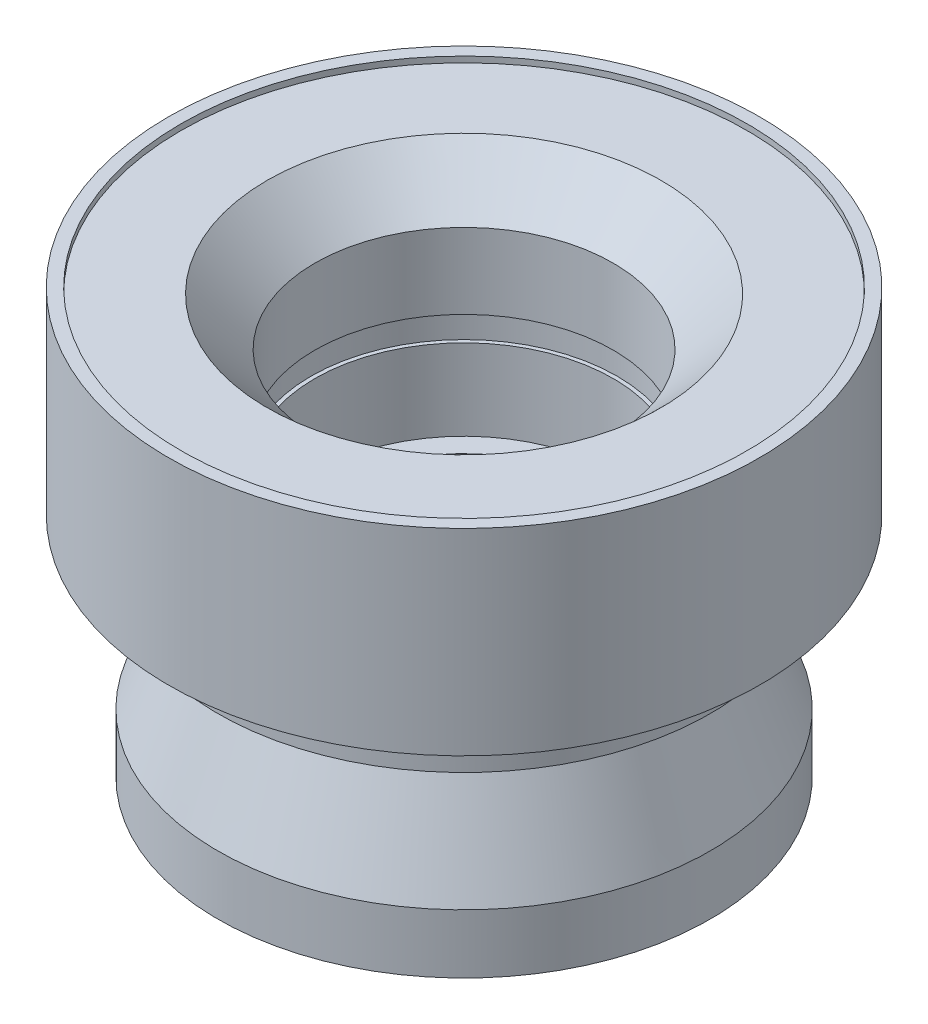
ISO-10303-21;
HEADER;
FILE_DESCRIPTION(('STEP AP214'),'2;1');
FILE_NAME('part.step','',(''),(''),'','','');
FILE_SCHEMA(('AUTOMOTIVE_DESIGN { 1 0 10303 214 1 1 1 1 }'));
ENDSEC;
DATA;
#1=APPLICATION_CONTEXT('core data for automotive mechanical design processes');
#2=APPLICATION_PROTOCOL_DEFINITION('international standard','automotive_design',2000,#1);
#3=PRODUCT_CONTEXT('',#1,'mechanical');
#4=PRODUCT('Part','Part','',(#3));
#5=PRODUCT_RELATED_PRODUCT_CATEGORY('part','',(#4));
#6=PRODUCT_DEFINITION_FORMATION('','',#4);
#7=PRODUCT_DEFINITION_CONTEXT('part definition',#1,'design');
#8=PRODUCT_DEFINITION('design','',#6,#7);
#9=PRODUCT_DEFINITION_SHAPE('','',#8);
#10=(LENGTH_UNIT() NAMED_UNIT(*) SI_UNIT(.MILLI.,.METRE.));
#11=(NAMED_UNIT(*) PLANE_ANGLE_UNIT() SI_UNIT($,.RADIAN.));
#12=(NAMED_UNIT(*) SI_UNIT($,.STERADIAN.) SOLID_ANGLE_UNIT());
#13=UNCERTAINTY_MEASURE_WITH_UNIT(LENGTH_MEASURE(1.E-05),#10,'distance_accuracy_value','');
#14=(GEOMETRIC_REPRESENTATION_CONTEXT(3) GLOBAL_UNCERTAINTY_ASSIGNED_CONTEXT((#13)) GLOBAL_UNIT_ASSIGNED_CONTEXT((#10,
#11,#12)) REPRESENTATION_CONTEXT('',''));
#15=CARTESIAN_POINT('',(0.,0.,0.));
#16=DIRECTION('',(0.,0.,1.));
#17=DIRECTION('',(1.,0.,0.));
#18=AXIS2_PLACEMENT_3D('',#15,#16,#17);
#19=CARTESIAN_POINT('',(36.5125,19.8120000000001,0.));
#20=DIRECTION('',(0.,-1.,0.));
#21=DIRECTION('',(1.,0.,0.));
#22=AXIS2_PLACEMENT_3D('',#19,#20,#21);
#23=PLANE('',#22);
#24=CARTESIAN_POINT('',(0.,19.8120000000001,0.));
#25=DIRECTION('',(0.,1.,0.));
#26=DIRECTION('',(-1.,0.,0.));
#27=AXIS2_PLACEMENT_3D('',#24,#25,#26);
#28=CIRCLE('',#27,36.5125);
#29=CARTESIAN_POINT('',(-36.5125,19.8120000000001,0.));
#30=VERTEX_POINT('',#29);
#31=EDGE_CURVE('E92',#30,#30,#28,.T.);
#32=ORIENTED_EDGE('',*,*,#31,.F.);
#33=EDGE_LOOP('',(#32));
#34=FACE_BOUND('',#33,.T.);
#35=CARTESIAN_POINT('',(0.,19.8120000000001,0.));
#36=DIRECTION('',(0.,1.,0.));
#37=DIRECTION('',(-1.,0.,0.));
#38=AXIS2_PLACEMENT_3D('',#35,#36,#37);
#39=CIRCLE('',#38,38.1);
#40=CARTESIAN_POINT('',(-38.1,19.8120000000001,0.));
#41=VERTEX_POINT('',#40);
#42=EDGE_CURVE('E10',#41,#41,#39,.T.);
#43=ORIENTED_EDGE('',*,*,#42,.T.);
#44=EDGE_LOOP('',(#43));
#45=FACE_BOUND('',#44,.T.);
#46=ADVANCED_FACE('F34',(#34,#45),#23,.F.);
#47=CARTESIAN_POINT('',(0.,41.9400409759733,0.));
#48=DIRECTION('',(0.,1.,0.));
#49=DIRECTION('',(-1.,0.,0.));
#50=AXIS2_PLACEMENT_3D('',#47,#48,#49);
#51=CYLINDRICAL_SURFACE('',#50,38.1);
#52=ORIENTED_EDGE('',*,*,#42,.F.);
#53=EDGE_LOOP('',(#52));
#54=FACE_BOUND('',#53,.T.);
#55=CARTESIAN_POINT('',(0.,-5.58799999999986,0.));
#56=DIRECTION('',(0.,1.,0.));
#57=DIRECTION('',(-1.,0.,0.));
#58=AXIS2_PLACEMENT_3D('',#55,#56,#57);
#59=CIRCLE('',#58,38.1);
#60=CARTESIAN_POINT('',(-38.1,-5.58799999999987,0.));
#61=VERTEX_POINT('',#60);
#62=EDGE_CURVE('E40',#61,#61,#59,.T.);
#63=ORIENTED_EDGE('',*,*,#62,.T.);
#64=EDGE_LOOP('',(#63));
#65=FACE_BOUND('',#64,.T.);
#66=ADVANCED_FACE('F99',(#54,#65),#51,.T.);
#67=CARTESIAN_POINT('',(38.1,-5.58799999999986,0.));
#68=DIRECTION('',(0.,1.,0.));
#69=DIRECTION('',(-1.,0.,0.));
#70=AXIS2_PLACEMENT_3D('',#67,#68,#69);
#71=PLANE('',#70);
#72=ORIENTED_EDGE('',*,*,#62,.F.);
#73=EDGE_LOOP('',(#72));
#74=FACE_BOUND('',#73,.T.);
#75=CARTESIAN_POINT('',(0.,-5.58799999999986,0.));
#76=DIRECTION('',(0.,1.,0.));
#77=DIRECTION('',(-1.,0.,0.));
#78=AXIS2_PLACEMENT_3D('',#75,#76,#77);
#79=CIRCLE('',#78,31.75);
#80=CARTESIAN_POINT('',(-31.75,-5.58799999999987,0.));
#81=VERTEX_POINT('',#80);
#82=EDGE_CURVE('E44',#81,#81,#79,.T.);
#83=ORIENTED_EDGE('',*,*,#82,.T.);
#84=EDGE_LOOP('',(#83));
#85=FACE_BOUND('',#84,.T.);
#86=ADVANCED_FACE('F103',(#74,#85),#71,.F.);
#87=CARTESIAN_POINT('',(0.,41.9400409759733,0.));
#88=DIRECTION('',(0.,1.,0.));
#89=DIRECTION('',(-1.,0.,0.));
#90=AXIS2_PLACEMENT_3D('',#87,#88,#89);
#91=CYLINDRICAL_SURFACE('',#90,31.75);
#92=ORIENTED_EDGE('',*,*,#82,.F.);
#93=EDGE_LOOP('',(#92));
#94=FACE_BOUND('',#93,.T.);
#95=CARTESIAN_POINT('',(0.,-11.9379999999999,0.));
#96=DIRECTION('',(0.,1.,0.));
#97=DIRECTION('',(-1.,0.,0.));
#98=AXIS2_PLACEMENT_3D('',#95,#96,#97);
#99=CIRCLE('',#98,31.75);
#100=CARTESIAN_POINT('',(-31.75,-11.9379999999999,0.));
#101=VERTEX_POINT('',#100);
#102=EDGE_CURVE('E48',#101,#101,#99,.T.);
#103=ORIENTED_EDGE('',*,*,#102,.T.);
#104=EDGE_LOOP('',(#103));
#105=FACE_BOUND('',#104,.T.);
#106=ADVANCED_FACE('F108',(#94,#105),#91,.T.);
#107=CARTESIAN_POINT('',(31.75,-11.9379999999999,0.));
#108=DIRECTION('',(0.,1.,0.));
#109=DIRECTION('',(-1.,0.,0.));
#110=AXIS2_PLACEMENT_3D('',#107,#108,#109);
#111=PLANE('',#110);
#112=ORIENTED_EDGE('',*,*,#102,.F.);
#113=EDGE_LOOP('',(#112));
#114=FACE_BOUND('',#113,.T.);
#115=CARTESIAN_POINT('',(0.,-11.9379999999999,0.));
#116=DIRECTION('',(0.,1.,0.));
#117=DIRECTION('',(-1.,0.,0.));
#118=AXIS2_PLACEMENT_3D('',#115,#116,#117);
#119=CIRCLE('',#118,26.1685298417782);
#120=CARTESIAN_POINT('',(-26.1685298417782,-11.9379999999999,0.));
#121=VERTEX_POINT('',#120);
#122=EDGE_CURVE('E53',#121,#121,#119,.T.);
#123=ORIENTED_EDGE('',*,*,#122,.T.);
#124=EDGE_LOOP('',(#123));
#125=FACE_BOUND('',#124,.T.);
#126=ADVANCED_FACE('F114',(#114,#125),#111,.F.);
#127=CARTESIAN_POINT('',(0.,-27.2729632270743,0.));
#128=DIRECTION('',(0.,-1.,0.));
#129=DIRECTION('',(1.,0.,0.));
#130=AXIS2_PLACEMENT_3D('',#127,#128,#129);
#131=CONICAL_SURFACE('',#130,31.75,0.34906585039886);
#132=ORIENTED_EDGE('',*,*,#122,.F.);
#133=EDGE_LOOP('',(#132));
#134=FACE_BOUND('',#133,.T.);
#135=CARTESIAN_POINT('',(0.,-27.2729632270743,0.));
#136=DIRECTION('',(0.,1.,0.));
#137=DIRECTION('',(-1.,0.,0.));
#138=AXIS2_PLACEMENT_3D('',#135,#136,#137);
#139=CIRCLE('',#138,31.75);
#140=CARTESIAN_POINT('',(-31.75,-27.2729632270744,0.));
#141=VERTEX_POINT('',#140);
#142=EDGE_CURVE('E56',#141,#141,#139,.T.);
#143=ORIENTED_EDGE('',*,*,#142,.T.);
#144=EDGE_LOOP('',(#143));
#145=FACE_BOUND('',#144,.T.);
#146=ADVANCED_FACE('F118',(#134,#145),#131,.T.);
#147=CARTESIAN_POINT('',(0.,41.9400409759733,0.));
#148=DIRECTION('',(0.,1.,0.));
#149=DIRECTION('',(-1.,0.,0.));
#150=AXIS2_PLACEMENT_3D('',#147,#148,#149);
#151=CYLINDRICAL_SURFACE('',#150,31.75);
#152=ORIENTED_EDGE('',*,*,#142,.F.);
#153=EDGE_LOOP('',(#152));
#154=FACE_BOUND('',#153,.T.);
#155=CARTESIAN_POINT('',(0.,-34.8929632270744,0.));
#156=DIRECTION('',(0.,1.,0.));
#157=DIRECTION('',(-1.,0.,0.));
#158=AXIS2_PLACEMENT_3D('',#155,#156,#157);
#159=CIRCLE('',#158,31.75);
#160=CARTESIAN_POINT('',(-31.75,-34.8929632270744,0.));
#161=VERTEX_POINT('',#160);
#162=EDGE_CURVE('E59',#161,#161,#159,.T.);
#163=ORIENTED_EDGE('',*,*,#162,.T.);
#164=EDGE_LOOP('',(#163));
#165=FACE_BOUND('',#164,.T.);
#166=ADVANCED_FACE('F122',(#154,#165),#151,.T.);
#167=CARTESIAN_POINT('',(31.75,-34.8929632270743,0.));
#168=DIRECTION('',(0.,1.,0.));
#169=DIRECTION('',(-1.,0.,0.));
#170=AXIS2_PLACEMENT_3D('',#167,#168,#169);
#171=PLANE('',#170);
#172=ORIENTED_EDGE('',*,*,#162,.F.);
#173=EDGE_LOOP('',(#172));
#174=FACE_BOUND('',#173,.T.);
#175=CARTESIAN_POINT('',(0.,-34.8929632270744,0.));
#176=DIRECTION('',(0.,1.,0.));
#177=DIRECTION('',(-1.,0.,0.));
#178=AXIS2_PLACEMENT_3D('',#175,#176,#177);
#179=CIRCLE('',#178,25.4);
#180=CARTESIAN_POINT('',(-25.4,-34.8929632270744,0.));
#181=VERTEX_POINT('',#180);
#182=EDGE_CURVE('E62',#181,#181,#179,.T.);
#183=ORIENTED_EDGE('',*,*,#182,.T.);
#184=EDGE_LOOP('',(#183));
#185=FACE_BOUND('',#184,.T.);
#186=ADVANCED_FACE('F126',(#174,#185),#171,.F.);
#187=CARTESIAN_POINT('',(0.,-10.4329960048952,0.));
#188=DIRECTION('',(0.,-1.,0.));
#189=DIRECTION('',(1.,0.,0.));
#190=AXIS2_PLACEMENT_3D('',#187,#188,#189);
#191=CONICAL_SURFACE('',#190,16.4973,0.34906585039886);
#192=ORIENTED_EDGE('',*,*,#182,.F.);
#193=EDGE_LOOP('',(#192));
#194=FACE_BOUND('',#193,.T.);
#195=CARTESIAN_POINT('',(0.,-10.4329960048952,0.));
#196=DIRECTION('',(0.,1.,0.));
#197=DIRECTION('',(-1.,0.,0.));
#198=AXIS2_PLACEMENT_3D('',#195,#196,#197);
#199=CIRCLE('',#198,16.4973);
#200=CARTESIAN_POINT('',(-16.4973,-10.4329960048952,0.));
#201=VERTEX_POINT('',#200);
#202=EDGE_CURVE('E65',#201,#201,#199,.T.);
#203=ORIENTED_EDGE('',*,*,#202,.T.);
#204=EDGE_LOOP('',(#203));
#205=FACE_BOUND('',#204,.T.);
#206=ADVANCED_FACE('F130',(#194,#205),#191,.F.);
#207=CARTESIAN_POINT('',(19.2405,-10.4329960048952,0.));
#208=DIRECTION('',(0.,-1.,0.));
#209=DIRECTION('',(1.,0.,0.));
#210=AXIS2_PLACEMENT_3D('',#207,#208,#209);
#211=PLANE('',#210);
#212=ORIENTED_EDGE('',*,*,#202,.F.);
#213=EDGE_LOOP('',(#212));
#214=FACE_BOUND('',#213,.T.);
#215=CARTESIAN_POINT('',(0.,-10.4329960048952,0.));
#216=DIRECTION('',(0.,1.,0.));
#217=DIRECTION('',(-1.,0.,0.));
#218=AXIS2_PLACEMENT_3D('',#215,#216,#217);
#219=CIRCLE('',#218,19.2405);
#220=CARTESIAN_POINT('',(-19.2405,-10.4329960048952,0.));
#221=VERTEX_POINT('',#220);
#222=EDGE_CURVE('E68',#221,#221,#219,.T.);
#223=ORIENTED_EDGE('',*,*,#222,.T.);
#224=EDGE_LOOP('',(#223));
#225=FACE_BOUND('',#224,.T.);
#226=ADVANCED_FACE('F134',(#214,#225),#211,.F.);
#227=CARTESIAN_POINT('',(0.,41.9400409759733,0.));
#228=DIRECTION('',(0.,1.,0.));
#229=DIRECTION('',(-1.,0.,0.));
#230=AXIS2_PLACEMENT_3D('',#227,#228,#229);
#231=CYLINDRICAL_SURFACE('',#230,19.2405);
#232=ORIENTED_EDGE('',*,*,#222,.F.);
#233=EDGE_LOOP('',(#232));
#234=FACE_BOUND('',#233,.T.);
#235=CARTESIAN_POINT('',(0.,0.,0.));
#236=DIRECTION('',(0.,1.,0.));
#237=DIRECTION('',(-1.,0.,0.));
#238=AXIS2_PLACEMENT_3D('',#235,#236,#237);
#239=CIRCLE('',#238,19.2405);
#240=CARTESIAN_POINT('',(-19.2405,0.,0.));
#241=VERTEX_POINT('',#240);
#242=EDGE_CURVE('E71',#241,#241,#239,.T.);
#243=ORIENTED_EDGE('',*,*,#242,.T.);
#244=EDGE_LOOP('',(#243));
#245=FACE_BOUND('',#244,.T.);
#246=ADVANCED_FACE('F138',(#234,#245),#231,.F.);
#247=CARTESIAN_POINT('',(19.2405,0.,0.));
#248=DIRECTION('',(0.,-1.,0.));
#249=DIRECTION('',(1.,0.,0.));
#250=AXIS2_PLACEMENT_3D('',#247,#248,#249);
#251=PLANE('',#250);
#252=ORIENTED_EDGE('',*,*,#242,.F.);
#253=EDGE_LOOP('',(#252));
#254=FACE_BOUND('',#253,.T.);
#255=CARTESIAN_POINT('',(0.,0.,0.));
#256=DIRECTION('',(0.,1.,0.));
#257=DIRECTION('',(-1.,0.,0.));
#258=AXIS2_PLACEMENT_3D('',#255,#256,#257);
#259=CIRCLE('',#258,19.7485);
#260=CARTESIAN_POINT('',(-19.7485,0.,0.));
#261=VERTEX_POINT('',#260);
#262=EDGE_CURVE('E74',#261,#261,#259,.T.);
#263=ORIENTED_EDGE('',*,*,#262,.T.);
#264=EDGE_LOOP('',(#263));
#265=FACE_BOUND('',#264,.T.);
#266=ADVANCED_FACE('F142',(#254,#265),#251,.F.);
#267=CARTESIAN_POINT('',(0.,41.9400409759733,0.));
#268=DIRECTION('',(0.,1.,0.));
#269=DIRECTION('',(-1.,0.,0.));
#270=AXIS2_PLACEMENT_3D('',#267,#268,#269);
#271=CYLINDRICAL_SURFACE('',#270,19.7485);
#272=ORIENTED_EDGE('',*,*,#262,.F.);
#273=EDGE_LOOP('',(#272));
#274=FACE_BOUND('',#273,.T.);
#275=CARTESIAN_POINT('',(0.,3.175,0.));
#276=DIRECTION('',(0.,1.,0.));
#277=DIRECTION('',(-1.,0.,0.));
#278=AXIS2_PLACEMENT_3D('',#275,#276,#277);
#279=CIRCLE('',#278,19.7485);
#280=CARTESIAN_POINT('',(-19.7485,3.17499999999999,0.));
#281=VERTEX_POINT('',#280);
#282=EDGE_CURVE('E77',#281,#281,#279,.T.);
#283=ORIENTED_EDGE('',*,*,#282,.T.);
#284=EDGE_LOOP('',(#283));
#285=FACE_BOUND('',#284,.T.);
#286=ADVANCED_FACE('F146',(#274,#285),#271,.F.);
#287=CARTESIAN_POINT('',(19.2405,3.175,0.));
#288=DIRECTION('',(0.,1.,0.));
#289=DIRECTION('',(-1.,0.,0.));
#290=AXIS2_PLACEMENT_3D('',#287,#288,#289);
#291=PLANE('',#290);
#292=ORIENTED_EDGE('',*,*,#282,.F.);
#293=EDGE_LOOP('',(#292));
#294=FACE_BOUND('',#293,.T.);
#295=CARTESIAN_POINT('',(0.,3.175,0.));
#296=DIRECTION('',(0.,1.,0.));
#297=DIRECTION('',(-1.,0.,0.));
#298=AXIS2_PLACEMENT_3D('',#295,#296,#297);
#299=CIRCLE('',#298,19.2405);
#300=CARTESIAN_POINT('',(-19.2405,3.17499999999999,0.));
#301=VERTEX_POINT('',#300);
#302=EDGE_CURVE('E80',#301,#301,#299,.T.);
#303=ORIENTED_EDGE('',*,*,#302,.T.);
#304=EDGE_LOOP('',(#303));
#305=FACE_BOUND('',#304,.T.);
#306=ADVANCED_FACE('F150',(#294,#305),#291,.F.);
#307=CARTESIAN_POINT('',(0.,41.9400409759733,0.));
#308=DIRECTION('',(0.,1.,0.));
#309=DIRECTION('',(-1.,0.,0.));
#310=AXIS2_PLACEMENT_3D('',#307,#308,#309);
#311=CYLINDRICAL_SURFACE('',#310,19.2405);
#312=ORIENTED_EDGE('',*,*,#302,.F.);
#313=EDGE_LOOP('',(#312));
#314=FACE_BOUND('',#313,.T.);
#315=CARTESIAN_POINT('',(0.,12.8905000000001,0.));
#316=DIRECTION('',(0.,1.,0.));
#317=DIRECTION('',(-1.,0.,0.));
#318=AXIS2_PLACEMENT_3D('',#315,#316,#317);
#319=CIRCLE('',#318,19.2405);
#320=CARTESIAN_POINT('',(-19.2405,12.8905000000001,0.));
#321=VERTEX_POINT('',#320);
#322=EDGE_CURVE('E83',#321,#321,#319,.T.);
#323=ORIENTED_EDGE('',*,*,#322,.T.);
#324=EDGE_LOOP('',(#323));
#325=FACE_BOUND('',#324,.T.);
#326=ADVANCED_FACE('F154',(#314,#325),#311,.F.);
#327=CARTESIAN_POINT('',(0.,19.0500000000002,0.));
#328=DIRECTION('',(0.,1.,0.));
#329=DIRECTION('',(-1.,0.,0.));
#330=AXIS2_PLACEMENT_3D('',#327,#328,#329);
#331=CONICAL_SURFACE('',#330,25.4,0.785398163397442);
#332=ORIENTED_EDGE('',*,*,#322,.F.);
#333=EDGE_LOOP('',(#332));
#334=FACE_BOUND('',#333,.T.);
#335=CARTESIAN_POINT('',(0.,19.0500000000002,0.));
#336=DIRECTION('',(0.,1.,0.));
#337=DIRECTION('',(-1.,0.,0.));
#338=AXIS2_PLACEMENT_3D('',#335,#336,#337);
#339=CIRCLE('',#338,25.4);
#340=CARTESIAN_POINT('',(-25.4,19.0500000000001,0.));
#341=VERTEX_POINT('',#340);
#342=EDGE_CURVE('E86',#341,#341,#339,.T.);
#343=ORIENTED_EDGE('',*,*,#342,.T.);
#344=EDGE_LOOP('',(#343));
#345=FACE_BOUND('',#344,.T.);
#346=ADVANCED_FACE('F158',(#334,#345),#331,.F.);
#347=CARTESIAN_POINT('',(36.5125,19.0500000000001,0.));
#348=DIRECTION('',(0.,-1.,0.));
#349=DIRECTION('',(1.,0.,0.));
#350=AXIS2_PLACEMENT_3D('',#347,#348,#349);
#351=PLANE('',#350);
#352=ORIENTED_EDGE('',*,*,#342,.F.);
#353=EDGE_LOOP('',(#352));
#354=FACE_BOUND('',#353,.T.);
#355=CARTESIAN_POINT('',(0.,19.0500000000001,0.));
#356=DIRECTION('',(0.,1.,0.));
#357=DIRECTION('',(-1.,0.,0.));
#358=AXIS2_PLACEMENT_3D('',#355,#356,#357);
#359=CIRCLE('',#358,36.5125);
#360=CARTESIAN_POINT('',(-36.5125,19.0500000000001,0.));
#361=VERTEX_POINT('',#360);
#362=EDGE_CURVE('E89',#361,#361,#359,.T.);
#363=ORIENTED_EDGE('',*,*,#362,.T.);
#364=EDGE_LOOP('',(#363));
#365=FACE_BOUND('',#364,.T.);
#366=ADVANCED_FACE('F162',(#354,#365),#351,.F.);
#367=CARTESIAN_POINT('',(0.,41.9400409759733,0.));
#368=DIRECTION('',(0.,1.,0.));
#369=DIRECTION('',(-1.,0.,0.));
#370=AXIS2_PLACEMENT_3D('',#367,#368,#369);
#371=CYLINDRICAL_SURFACE('',#370,36.5125);
#372=ORIENTED_EDGE('',*,*,#362,.F.);
#373=EDGE_LOOP('',(#372));
#374=FACE_BOUND('',#373,.T.);
#375=ORIENTED_EDGE('',*,*,#31,.T.);
#376=EDGE_LOOP('',(#375));
#377=FACE_BOUND('',#376,.T.);
#378=ADVANCED_FACE('F96',(#374,#377),#371,.F.);
#379=CLOSED_SHELL('',(#46,#66,#86,#106,#126,#146,#166,#186,#206,#226,#246,#266,#286,#306,#326,
#346,#366,#378));
#380=MANIFOLD_SOLID_BREP('B2',#379);
#381=ADVANCED_BREP_SHAPE_REPRESENTATION('',(#18,#380),#14);
#382=SHAPE_DEFINITION_REPRESENTATION(#9,#381);
ENDSEC;
END-ISO-10303-21;
